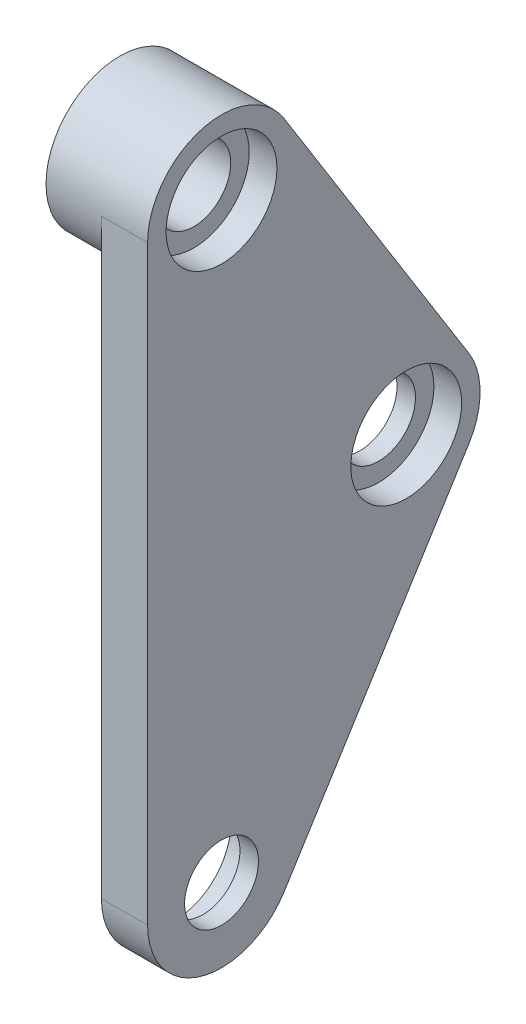
ISO-10303-21;
HEADER;
FILE_DESCRIPTION(('STEP AP214'),'2;1');
FILE_NAME('part.step','',(''),(''),'','','');
FILE_SCHEMA(('AUTOMOTIVE_DESIGN { 1 0 10303 214 1 1 1 1 }'));
ENDSEC;
DATA;
#1=APPLICATION_CONTEXT('core data for automotive mechanical design processes');
#2=APPLICATION_PROTOCOL_DEFINITION('international standard','automotive_design',2000,#1);
#3=PRODUCT_CONTEXT('',#1,'mechanical');
#4=PRODUCT('Part','Part','',(#3));
#5=PRODUCT_RELATED_PRODUCT_CATEGORY('part','',(#4));
#6=PRODUCT_DEFINITION_FORMATION('','',#4);
#7=PRODUCT_DEFINITION_CONTEXT('part definition',#1,'design');
#8=PRODUCT_DEFINITION('design','',#6,#7);
#9=PRODUCT_DEFINITION_SHAPE('','',#8);
#10=(LENGTH_UNIT() NAMED_UNIT(*) SI_UNIT(.MILLI.,.METRE.));
#11=(NAMED_UNIT(*) PLANE_ANGLE_UNIT() SI_UNIT($,.RADIAN.));
#12=(NAMED_UNIT(*) SI_UNIT($,.STERADIAN.) SOLID_ANGLE_UNIT());
#13=UNCERTAINTY_MEASURE_WITH_UNIT(LENGTH_MEASURE(1.E-05),#10,'distance_accuracy_value','');
#14=(GEOMETRIC_REPRESENTATION_CONTEXT(3) GLOBAL_UNCERTAINTY_ASSIGNED_CONTEXT((#13)) GLOBAL_UNIT_ASSIGNED_CONTEXT((#10,
#11,#12)) REPRESENTATION_CONTEXT('',''));
#15=CARTESIAN_POINT('',(0.,0.,0.));
#16=DIRECTION('',(0.,0.,1.));
#17=DIRECTION('',(1.,0.,0.));
#18=AXIS2_PLACEMENT_3D('',#15,#16,#17);
#19=CARTESIAN_POINT('',(2.5,-4.,-4.));
#20=DIRECTION('',(-1.,0.,0.));
#21=DIRECTION('',(0.,0.,1.));
#22=AXIS2_PLACEMENT_3D('',#19,#20,#21);
#23=CYLINDRICAL_SURFACE('',#22,2.);
#24=CARTESIAN_POINT('',(-3.,-4.,-4.));
#25=DIRECTION('',(1.,0.,0.));
#26=DIRECTION('',(0.,0.,-1.));
#27=AXIS2_PLACEMENT_3D('',#24,#25,#26);
#28=CIRCLE('',#27,2.);
#29=CARTESIAN_POINT('',(-3.,-4.,-6.));
#30=VERTEX_POINT('',#29);
#31=EDGE_CURVE('E212',#30,#30,#28,.T.);
#32=ORIENTED_EDGE('',*,*,#31,.F.);
#33=EDGE_LOOP('',(#32));
#34=FACE_BOUND('',#33,.T.);
#35=CARTESIAN_POINT('',(1.,-4.,-4.));
#36=DIRECTION('',(1.,0.,0.));
#37=DIRECTION('',(0.,0.,-1.));
#38=AXIS2_PLACEMENT_3D('',#35,#36,#37);
#39=CIRCLE('',#38,2.);
#40=CARTESIAN_POINT('',(1.,-4.,-6.));
#41=VERTEX_POINT('',#40);
#42=EDGE_CURVE('E215',#41,#41,#39,.F.);
#43=ORIENTED_EDGE('',*,*,#42,.F.);
#44=EDGE_LOOP('',(#43));
#45=FACE_BOUND('',#44,.T.);
#46=ADVANCED_FACE('F99',(#34,#45),#23,.F.);
#47=CARTESIAN_POINT('',(2.5,-20.,-14.));
#48=DIRECTION('',(-1.,0.,0.));
#49=DIRECTION('',(0.,0.,1.));
#50=AXIS2_PLACEMENT_3D('',#47,#48,#49);
#51=CYLINDRICAL_SURFACE('',#50,2.);
#52=CARTESIAN_POINT('',(0.,-20.,-14.));
#53=DIRECTION('',(1.,0.,0.));
#54=DIRECTION('',(0.,0.,-1.));
#55=AXIS2_PLACEMENT_3D('',#52,#53,#54);
#56=CIRCLE('',#55,2.);
#57=CARTESIAN_POINT('',(0.,-20.,-16.));
#58=VERTEX_POINT('',#57);
#59=EDGE_CURVE('E233',#58,#58,#56,.F.);
#60=ORIENTED_EDGE('',*,*,#59,.T.);
#61=EDGE_LOOP('',(#60));
#62=FACE_BOUND('',#61,.T.);
#63=CARTESIAN_POINT('',(1.,-20.,-14.));
#64=DIRECTION('',(1.,0.,0.));
#65=DIRECTION('',(0.,0.,-1.));
#66=AXIS2_PLACEMENT_3D('',#63,#64,#65);
#67=CIRCLE('',#66,2.);
#68=CARTESIAN_POINT('',(1.,-20.,-16.));
#69=VERTEX_POINT('',#68);
#70=EDGE_CURVE('E205',#69,#69,#67,.T.);
#71=ORIENTED_EDGE('',*,*,#70,.T.);
#72=EDGE_LOOP('',(#71));
#73=FACE_BOUND('',#72,.T.);
#74=ADVANCED_FACE('F259',(#62,#73),#51,.F.);
#75=CARTESIAN_POINT('',(2.5,2.79415306338351,-4.47064490141361));
#76=DIRECTION('',(0.,0.52999894000318,-0.847998304005088));
#77=DIRECTION('',(0.,0.847998304005088,0.52999894000318));
#78=AXIS2_PLACEMENT_3D('',#75,#76,#77);
#79=PLANE('',#78);
#80=DIRECTION('',(0.,-0.847998304005088,-0.52999894000318));
#81=VECTOR('',#80,1.);
#82=CARTESIAN_POINT('',(0.,2.79415306338351,-4.47064490141361));
#83=LINE('',#82,#81);
#84=CARTESIAN_POINT('',(0.,-1.88000423998728,-7.39199321602035));
#85=VERTEX_POINT('',#84);
#86=CARTESIAN_POINT('',(0.,-17.8800042399873,-17.3919932160204));
#87=VERTEX_POINT('',#86);
#88=EDGE_CURVE('E187',#85,#87,#83,.T.);
#89=ORIENTED_EDGE('',*,*,#88,.F.);
#90=DIRECTION('',(-1.,0.,0.));
#91=VECTOR('',#90,1.);
#92=CARTESIAN_POINT('',(2.5,-1.88000423998728,-7.39199321602035));
#93=LINE('',#92,#91);
#94=CARTESIAN_POINT('',(2.5,-1.88000423998728,-7.39199321602035));
#95=VERTEX_POINT('',#94);
#96=EDGE_CURVE('E196',#95,#85,#93,.T.);
#97=ORIENTED_EDGE('',*,*,#96,.F.);
#98=DIRECTION('',(0.,-0.847998304005088,-0.52999894000318));
#99=VECTOR('',#98,1.);
#100=CARTESIAN_POINT('',(2.5,2.79415306338351,-4.47064490141361));
#101=LINE('',#100,#99);
#102=CARTESIAN_POINT('',(2.5,-17.8800042399873,-17.3919932160204));
#103=VERTEX_POINT('',#102);
#104=EDGE_CURVE('E180',#95,#103,#101,.T.);
#105=ORIENTED_EDGE('',*,*,#104,.T.);
#106=DIRECTION('',(-1.,0.,0.));
#107=VECTOR('',#106,1.);
#108=CARTESIAN_POINT('',(2.5,-17.8800042399873,-17.3919932160204));
#109=LINE('',#108,#107);
#110=EDGE_CURVE('E109',#103,#87,#109,.T.);
#111=ORIENTED_EDGE('',*,*,#110,.T.);
#112=EDGE_LOOP('',(#89,#97,#105,#111));
#113=FACE_BOUND('',#112,.T.);
#114=ADVANCED_FACE('F265',(#113),#79,.T.);
#115=CARTESIAN_POINT('',(2.5,0.,0.));
#116=DIRECTION('',(0.,0.,-1.));
#117=DIRECTION('',(-1.,0.,0.));
#118=AXIS2_PLACEMENT_3D('',#115,#116,#117);
#119=PLANE('',#118);
#120=DIRECTION('',(0.,-1.,0.));
#121=VECTOR('',#120,1.);
#122=CARTESIAN_POINT('',(0.,0.,0.));
#123=LINE('',#122,#121);
#124=CARTESIAN_POINT('',(0.,-4.,0.));
#125=VERTEX_POINT('',#124);
#126=CARTESIAN_POINT('',(0.,-36.,0.));
#127=VERTEX_POINT('',#126);
#128=EDGE_CURVE('E162',#125,#127,#123,.T.);
#129=ORIENTED_EDGE('',*,*,#128,.T.);
#130=DIRECTION('',(-1.,0.,0.));
#131=VECTOR('',#130,1.);
#132=CARTESIAN_POINT('',(2.5,-36.,0.));
#133=LINE('',#132,#131);
#134=CARTESIAN_POINT('',(2.5,-36.,0.));
#135=VERTEX_POINT('',#134);
#136=EDGE_CURVE('E155',#135,#127,#133,.T.);
#137=ORIENTED_EDGE('',*,*,#136,.F.);
#138=DIRECTION('',(0.,-1.,0.));
#139=VECTOR('',#138,1.);
#140=CARTESIAN_POINT('',(2.5,0.,0.));
#141=LINE('',#140,#139);
#142=CARTESIAN_POINT('',(2.5,-4.,0.));
#143=VERTEX_POINT('',#142);
#144=EDGE_CURVE('E160',#143,#135,#141,.T.);
#145=ORIENTED_EDGE('',*,*,#144,.F.);
#146=DIRECTION('',(-1.,0.,0.));
#147=VECTOR('',#146,1.);
#148=CARTESIAN_POINT('',(2.5,-4.,0.));
#149=LINE('',#148,#147);
#150=EDGE_CURVE('E165',#143,#125,#149,.T.);
#151=ORIENTED_EDGE('',*,*,#150,.T.);
#152=EDGE_LOOP('',(#129,#137,#145,#151));
#153=FACE_BOUND('',#152,.T.);
#154=ADVANCED_FACE('F157',(#153),#119,.F.);
#155=CARTESIAN_POINT('',(2.5,-14.0301081195633,-22.4481729913013));
#156=DIRECTION('',(0.,-0.52999894000318,-0.847998304005088));
#157=DIRECTION('',(0.,0.847998304005088,-0.52999894000318));
#158=AXIS2_PLACEMENT_3D('',#155,#156,#157);
#159=PLANE('',#158);
#160=DIRECTION('',(0.,-0.847998304005088,0.52999894000318));
#161=VECTOR('',#160,1.);
#162=CARTESIAN_POINT('',(0.,-14.0301081195633,-22.4481729913013));
#163=LINE('',#162,#161);
#164=CARTESIAN_POINT('',(0.,-22.1199957600127,-17.3919932160204));
#165=VERTEX_POINT('',#164);
#166=CARTESIAN_POINT('',(0.,-38.1199957600127,-7.39199321602035));
#167=VERTEX_POINT('',#166);
#168=EDGE_CURVE('E184',#165,#167,#163,.T.);
#169=ORIENTED_EDGE('',*,*,#168,.F.);
#170=DIRECTION('',(-1.,0.,0.));
#171=VECTOR('',#170,1.);
#172=CARTESIAN_POINT('',(2.5,-22.1199957600127,-17.3919932160204));
#173=LINE('',#172,#171);
#174=CARTESIAN_POINT('',(2.5,-22.1199957600127,-17.3919932160204));
#175=VERTEX_POINT('',#174);
#176=EDGE_CURVE('E118',#175,#165,#173,.T.);
#177=ORIENTED_EDGE('',*,*,#176,.F.);
#178=DIRECTION('',(0.,-0.847998304005088,0.52999894000318));
#179=VECTOR('',#178,1.);
#180=CARTESIAN_POINT('',(2.5,-14.0301081195633,-22.4481729913013));
#181=LINE('',#180,#179);
#182=CARTESIAN_POINT('',(2.5,-38.1199957600127,-7.39199321602035));
#183=VERTEX_POINT('',#182);
#184=EDGE_CURVE('E179',#175,#183,#181,.T.);
#185=ORIENTED_EDGE('',*,*,#184,.T.);
#186=DIRECTION('',(-1.,0.,0.));
#187=VECTOR('',#186,1.);
#188=CARTESIAN_POINT('',(2.5,-38.1199957600127,-7.39199321602035));
#189=LINE('',#188,#187);
#190=EDGE_CURVE('E135',#183,#167,#189,.T.);
#191=ORIENTED_EDGE('',*,*,#190,.T.);
#192=EDGE_LOOP('',(#169,#177,#185,#191));
#193=FACE_BOUND('',#192,.T.);
#194=ADVANCED_FACE('F310',(#193),#159,.T.);
#195=CARTESIAN_POINT('',(0.,0.,0.));
#196=DIRECTION('',(1.,0.,0.));
#197=DIRECTION('',(0.,0.,-1.));
#198=AXIS2_PLACEMENT_3D('',#195,#196,#197);
#199=PLANE('',#198);
#200=CARTESIAN_POINT('',(0.,-36.,-4.));
#201=DIRECTION('',(1.,0.,0.));
#202=DIRECTION('',(0.,0.,-1.));
#203=AXIS2_PLACEMENT_3D('',#200,#201,#202);
#204=CIRCLE('',#203,3.);
#205=CARTESIAN_POINT('',(0.,-36.,-7.));
#206=VERTEX_POINT('',#205);
#207=EDGE_CURVE('E301',#206,#206,#204,.T.);
#208=ORIENTED_EDGE('',*,*,#207,.T.);
#209=EDGE_LOOP('',(#208));
#210=FACE_BOUND('',#209,.T.);
#211=ORIENTED_EDGE('',*,*,#59,.F.);
#212=EDGE_LOOP('',(#211));
#213=FACE_BOUND('',#212,.T.);
#214=ORIENTED_EDGE('',*,*,#128,.F.);
#215=CARTESIAN_POINT('',(0.,-4.,-4.));
#216=DIRECTION('',(1.,0.,0.));
#217=DIRECTION('',(0.,0.,-1.));
#218=AXIS2_PLACEMENT_3D('',#215,#216,#217);
#219=CIRCLE('',#218,4.);
#220=EDGE_CURVE('E12',#125,#85,#219,.T.);
#221=ORIENTED_EDGE('',*,*,#220,.T.);
#222=ORIENTED_EDGE('',*,*,#88,.T.);
#223=CARTESIAN_POINT('',(0.,-20.,-14.));
#224=DIRECTION('',(1.,0.,0.));
#225=DIRECTION('',(0.,0.,-1.));
#226=AXIS2_PLACEMENT_3D('',#223,#224,#225);
#227=CIRCLE('',#226,4.);
#228=EDGE_CURVE('E171',#165,#87,#227,.T.);
#229=ORIENTED_EDGE('',*,*,#228,.F.);
#230=ORIENTED_EDGE('',*,*,#168,.T.);
#231=CARTESIAN_POINT('',(0.,-36.,-4.));
#232=DIRECTION('',(1.,0.,0.));
#233=DIRECTION('',(0.,0.,-1.));
#234=AXIS2_PLACEMENT_3D('',#231,#232,#233);
#235=CIRCLE('',#234,4.);
#236=EDGE_CURVE('E172',#127,#167,#235,.T.);
#237=ORIENTED_EDGE('',*,*,#236,.F.);
#238=EDGE_LOOP('',(#214,#221,#222,#229,#230,#237));
#239=FACE_BOUND('',#238,.T.);
#240=ADVANCED_FACE('F306',(#210,#213,#239),#199,.F.);
#241=CARTESIAN_POINT('',(2.5,0.,0.));
#242=DIRECTION('',(1.,0.,0.));
#243=DIRECTION('',(0.,0.,-1.));
#244=AXIS2_PLACEMENT_3D('',#241,#242,#243);
#245=PLANE('',#244);
#246=CARTESIAN_POINT('',(2.5,-4.,-4.));
#247=DIRECTION('',(1.,0.,0.));
#248=DIRECTION('',(0.,0.,-1.));
#249=AXIS2_PLACEMENT_3D('',#246,#247,#248);
#250=CIRCLE('',#249,3.);
#251=CARTESIAN_POINT('',(2.5,-4.,-7.));
#252=VERTEX_POINT('',#251);
#253=EDGE_CURVE('E220',#252,#252,#250,.T.);
#254=ORIENTED_EDGE('',*,*,#253,.F.);
#255=EDGE_LOOP('',(#254));
#256=FACE_BOUND('',#255,.T.);
#257=CARTESIAN_POINT('',(2.5,-20.,-14.));
#258=DIRECTION('',(1.,0.,0.));
#259=DIRECTION('',(0.,0.,-1.));
#260=AXIS2_PLACEMENT_3D('',#257,#258,#259);
#261=CIRCLE('',#260,3.);
#262=CARTESIAN_POINT('',(2.5,-20.,-17.));
#263=VERTEX_POINT('',#262);
#264=EDGE_CURVE('E226',#263,#263,#261,.T.);
#265=ORIENTED_EDGE('',*,*,#264,.F.);
#266=EDGE_LOOP('',(#265));
#267=FACE_BOUND('',#266,.T.);
#268=CARTESIAN_POINT('',(2.5,-36.,-4.));
#269=DIRECTION('',(1.,0.,0.));
#270=DIRECTION('',(0.,0.,-1.));
#271=AXIS2_PLACEMENT_3D('',#268,#269,#270);
#272=CIRCLE('',#271,2.);
#273=CARTESIAN_POINT('',(2.5,-36.,-6.));
#274=VERTEX_POINT('',#273);
#275=EDGE_CURVE('E207',#274,#274,#272,.T.);
#276=ORIENTED_EDGE('',*,*,#275,.F.);
#277=EDGE_LOOP('',(#276));
#278=FACE_BOUND('',#277,.T.);
#279=ORIENTED_EDGE('',*,*,#184,.F.);
#280=CARTESIAN_POINT('',(2.5,-20.,-14.));
#281=DIRECTION('',(1.,0.,0.));
#282=DIRECTION('',(0.,0.,-1.));
#283=AXIS2_PLACEMENT_3D('',#280,#281,#282);
#284=CIRCLE('',#283,4.);
#285=EDGE_CURVE('E201',#175,#103,#284,.T.);
#286=ORIENTED_EDGE('',*,*,#285,.T.);
#287=ORIENTED_EDGE('',*,*,#104,.F.);
#288=CARTESIAN_POINT('',(2.5,-4.,-4.));
#289=DIRECTION('',(1.,0.,0.));
#290=DIRECTION('',(0.,0.,-1.));
#291=AXIS2_PLACEMENT_3D('',#288,#289,#290);
#292=CIRCLE('',#291,4.);
#293=EDGE_CURVE('E178',#95,#143,#292,.T.);
#294=ORIENTED_EDGE('',*,*,#293,.T.);
#295=ORIENTED_EDGE('',*,*,#144,.T.);
#296=CARTESIAN_POINT('',(2.5,-36.,-4.));
#297=DIRECTION('',(1.,0.,0.));
#298=DIRECTION('',(0.,0.,-1.));
#299=AXIS2_PLACEMENT_3D('',#296,#297,#298);
#300=CIRCLE('',#299,4.);
#301=EDGE_CURVE('E168',#135,#183,#300,.T.);
#302=ORIENTED_EDGE('',*,*,#301,.T.);
#303=EDGE_LOOP('',(#279,#286,#287,#294,#295,#302));
#304=FACE_BOUND('',#303,.T.);
#305=ADVANCED_FACE('F175',(#256,#267,#278,#304),#245,.T.);
#306=CARTESIAN_POINT('',(2.5,-36.,-4.));
#307=DIRECTION('',(-1.,0.,0.));
#308=DIRECTION('',(0.,0.,1.));
#309=AXIS2_PLACEMENT_3D('',#306,#307,#308);
#310=CYLINDRICAL_SURFACE('',#309,4.);
#311=ORIENTED_EDGE('',*,*,#301,.F.);
#312=ORIENTED_EDGE('',*,*,#136,.T.);
#313=ORIENTED_EDGE('',*,*,#236,.T.);
#314=ORIENTED_EDGE('',*,*,#190,.F.);
#315=EDGE_LOOP('',(#311,#312,#313,#314));
#316=FACE_BOUND('',#315,.T.);
#317=ADVANCED_FACE('F101',(#316),#310,.T.);
#318=CARTESIAN_POINT('',(2.5,-20.,-14.));
#319=DIRECTION('',(-1.,0.,0.));
#320=DIRECTION('',(0.,0.,1.));
#321=AXIS2_PLACEMENT_3D('',#318,#319,#320);
#322=CYLINDRICAL_SURFACE('',#321,4.);
#323=ORIENTED_EDGE('',*,*,#228,.T.);
#324=ORIENTED_EDGE('',*,*,#110,.F.);
#325=ORIENTED_EDGE('',*,*,#285,.F.);
#326=ORIENTED_EDGE('',*,*,#176,.T.);
#327=EDGE_LOOP('',(#323,#324,#325,#326));
#328=FACE_BOUND('',#327,.T.);
#329=ADVANCED_FACE('F254',(#328),#322,.T.);
#330=CARTESIAN_POINT('',(2.5,-4.,-4.));
#331=DIRECTION('',(-1.,0.,0.));
#332=DIRECTION('',(0.,0.,1.));
#333=AXIS2_PLACEMENT_3D('',#330,#331,#332);
#334=CYLINDRICAL_SURFACE('',#333,4.);
#335=ORIENTED_EDGE('',*,*,#293,.F.);
#336=ORIENTED_EDGE('',*,*,#96,.T.);
#337=ORIENTED_EDGE('',*,*,#220,.F.);
#338=ORIENTED_EDGE('',*,*,#150,.F.);
#339=EDGE_LOOP('',(#335,#336,#337,#338));
#340=FACE_BOUND('',#339,.T.);
#341=CARTESIAN_POINT('',(-3.,-4.,-4.));
#342=DIRECTION('',(1.,0.,0.));
#343=DIRECTION('',(0.,0.,-1.));
#344=AXIS2_PLACEMENT_3D('',#341,#342,#343);
#345=CIRCLE('',#344,4.);
#346=CARTESIAN_POINT('',(-3.,-4.,-8.));
#347=VERTEX_POINT('',#346);
#348=EDGE_CURVE('E204',#347,#347,#345,.T.);
#349=ORIENTED_EDGE('',*,*,#348,.T.);
#350=EDGE_LOOP('',(#349));
#351=FACE_BOUND('',#350,.T.);
#352=ADVANCED_FACE('F240',(#340,#351),#334,.T.);
#353=CARTESIAN_POINT('',(-3.,-4.,-4.));
#354=DIRECTION('',(1.,0.,0.));
#355=DIRECTION('',(0.,0.,-1.));
#356=AXIS2_PLACEMENT_3D('',#353,#354,#355);
#357=PLANE('',#356);
#358=ORIENTED_EDGE('',*,*,#31,.T.);
#359=EDGE_LOOP('',(#358));
#360=FACE_BOUND('',#359,.T.);
#361=ORIENTED_EDGE('',*,*,#348,.F.);
#362=EDGE_LOOP('',(#361));
#363=FACE_BOUND('',#362,.T.);
#364=ADVANCED_FACE('F242',(#360,#363),#357,.F.);
#365=CARTESIAN_POINT('',(2.5,-36.,-4.));
#366=DIRECTION('',(-1.,0.,0.));
#367=DIRECTION('',(0.,0.,1.));
#368=AXIS2_PLACEMENT_3D('',#365,#366,#367);
#369=CYLINDRICAL_SURFACE('',#368,2.);
#370=CARTESIAN_POINT('',(1.5,-36.,-4.));
#371=DIRECTION('',(1.,0.,0.));
#372=DIRECTION('',(0.,0.,-1.));
#373=AXIS2_PLACEMENT_3D('',#370,#371,#372);
#374=CIRCLE('',#373,2.);
#375=CARTESIAN_POINT('',(1.5,-36.,-6.));
#376=VERTEX_POINT('',#375);
#377=EDGE_CURVE('E103',#376,#376,#374,.T.);
#378=ORIENTED_EDGE('',*,*,#377,.F.);
#379=EDGE_LOOP('',(#378));
#380=FACE_BOUND('',#379,.T.);
#381=ORIENTED_EDGE('',*,*,#275,.T.);
#382=EDGE_LOOP('',(#381));
#383=FACE_BOUND('',#382,.T.);
#384=ADVANCED_FACE('F244',(#380,#383),#369,.F.);
#385=CARTESIAN_POINT('',(1.,-20.,-14.));
#386=DIRECTION('',(1.,0.,0.));
#387=DIRECTION('',(0.,0.,-1.));
#388=AXIS2_PLACEMENT_3D('',#385,#386,#387);
#389=CYLINDRICAL_SURFACE('',#388,3.);
#390=CARTESIAN_POINT('',(1.,-20.,-14.));
#391=DIRECTION('',(1.,0.,0.));
#392=DIRECTION('',(0.,0.,-1.));
#393=AXIS2_PLACEMENT_3D('',#390,#391,#392);
#394=CIRCLE('',#393,3.);
#395=CARTESIAN_POINT('',(1.,-20.,-17.));
#396=VERTEX_POINT('',#395);
#397=EDGE_CURVE('E229',#396,#396,#394,.T.);
#398=ORIENTED_EDGE('',*,*,#397,.F.);
#399=EDGE_LOOP('',(#398));
#400=FACE_BOUND('',#399,.T.);
#401=ORIENTED_EDGE('',*,*,#264,.T.);
#402=EDGE_LOOP('',(#401));
#403=FACE_BOUND('',#402,.T.);
#404=ADVANCED_FACE('F251',(#400,#403),#389,.F.);
#405=CARTESIAN_POINT('',(1.,-20.,-14.));
#406=DIRECTION('',(1.,0.,0.));
#407=DIRECTION('',(0.,0.,-1.));
#408=AXIS2_PLACEMENT_3D('',#405,#406,#407);
#409=PLANE('',#408);
#410=ORIENTED_EDGE('',*,*,#70,.F.);
#411=EDGE_LOOP('',(#410));
#412=FACE_BOUND('',#411,.T.);
#413=ORIENTED_EDGE('',*,*,#397,.T.);
#414=EDGE_LOOP('',(#413));
#415=FACE_BOUND('',#414,.T.);
#416=ADVANCED_FACE('F271',(#412,#415),#409,.T.);
#417=CARTESIAN_POINT('',(1.,-4.,-4.));
#418=DIRECTION('',(1.,0.,0.));
#419=DIRECTION('',(0.,0.,-1.));
#420=AXIS2_PLACEMENT_3D('',#417,#418,#419);
#421=CYLINDRICAL_SURFACE('',#420,3.);
#422=CARTESIAN_POINT('',(1.,-4.,-4.));
#423=DIRECTION('',(1.,0.,0.));
#424=DIRECTION('',(0.,0.,-1.));
#425=AXIS2_PLACEMENT_3D('',#422,#423,#424);
#426=CIRCLE('',#425,3.);
#427=CARTESIAN_POINT('',(1.,-4.,-7.));
#428=VERTEX_POINT('',#427);
#429=EDGE_CURVE('E208',#428,#428,#426,.T.);
#430=ORIENTED_EDGE('',*,*,#429,.F.);
#431=EDGE_LOOP('',(#430));
#432=FACE_BOUND('',#431,.T.);
#433=ORIENTED_EDGE('',*,*,#253,.T.);
#434=EDGE_LOOP('',(#433));
#435=FACE_BOUND('',#434,.T.);
#436=ADVANCED_FACE('F274',(#432,#435),#421,.F.);
#437=CARTESIAN_POINT('',(1.,0.,0.));
#438=DIRECTION('',(1.,0.,0.));
#439=DIRECTION('',(0.,0.,-1.));
#440=AXIS2_PLACEMENT_3D('',#437,#438,#439);
#441=PLANE('',#440);
#442=ORIENTED_EDGE('',*,*,#42,.T.);
#443=EDGE_LOOP('',(#442));
#444=FACE_BOUND('',#443,.T.);
#445=ORIENTED_EDGE('',*,*,#429,.T.);
#446=EDGE_LOOP('',(#445));
#447=FACE_BOUND('',#446,.T.);
#448=ADVANCED_FACE('F281',(#444,#447),#441,.T.);
#449=CARTESIAN_POINT('',(1.5,-36.,-4.));
#450=DIRECTION('',(-1.,0.,0.));
#451=DIRECTION('',(0.,0.,1.));
#452=AXIS2_PLACEMENT_3D('',#449,#450,#451);
#453=CYLINDRICAL_SURFACE('',#452,3.);
#454=CARTESIAN_POINT('',(1.5,-36.,-4.));
#455=DIRECTION('',(1.,0.,0.));
#456=DIRECTION('',(0.,0.,-1.));
#457=AXIS2_PLACEMENT_3D('',#454,#455,#456);
#458=CIRCLE('',#457,3.);
#459=CARTESIAN_POINT('',(1.5,-36.,-7.));
#460=VERTEX_POINT('',#459);
#461=EDGE_CURVE('E300',#460,#460,#458,.T.);
#462=ORIENTED_EDGE('',*,*,#461,.T.);
#463=EDGE_LOOP('',(#462));
#464=FACE_BOUND('',#463,.T.);
#465=ORIENTED_EDGE('',*,*,#207,.F.);
#466=EDGE_LOOP('',(#465));
#467=FACE_BOUND('',#466,.T.);
#468=ADVANCED_FACE('F285',(#464,#467),#453,.F.);
#469=CARTESIAN_POINT('',(1.5,-36.,-4.));
#470=DIRECTION('',(1.,0.,0.));
#471=DIRECTION('',(0.,0.,-1.));
#472=AXIS2_PLACEMENT_3D('',#469,#470,#471);
#473=PLANE('',#472);
#474=ORIENTED_EDGE('',*,*,#377,.T.);
#475=EDGE_LOOP('',(#474));
#476=FACE_BOUND('',#475,.T.);
#477=ORIENTED_EDGE('',*,*,#461,.F.);
#478=EDGE_LOOP('',(#477));
#479=FACE_BOUND('',#478,.T.);
#480=ADVANCED_FACE('F289',(#476,#479),#473,.F.);
#481=CLOSED_SHELL('',(#46,#74,#114,#154,#194,#240,#305,#317,#329,#352,#364,#384,#404,#416,#436,
#448,#468,#480));
#482=MANIFOLD_SOLID_BREP('B2',#481);
#483=ADVANCED_BREP_SHAPE_REPRESENTATION('',(#18,#482),#14);
#484=SHAPE_DEFINITION_REPRESENTATION(#9,#483);
ENDSEC;
END-ISO-10303-21;
